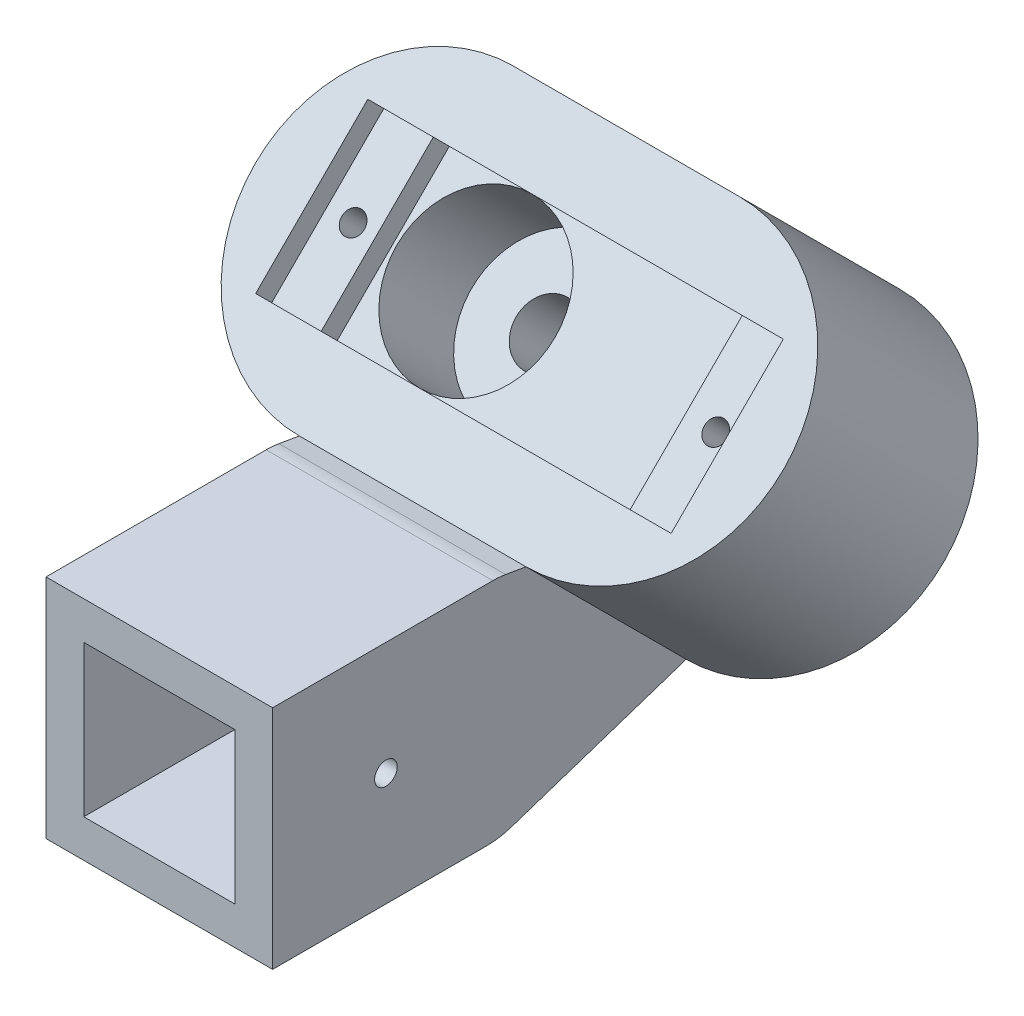
ISO-10303-21;
HEADER;
FILE_DESCRIPTION(('STEP AP214'),'2;1');
FILE_NAME('part.step','',(''),(''),'','','');
FILE_SCHEMA(('AUTOMOTIVE_DESIGN { 1 0 10303 214 1 1 1 1 }'));
ENDSEC;
DATA;
#1=APPLICATION_CONTEXT('core data for automotive mechanical design processes');
#2=APPLICATION_PROTOCOL_DEFINITION('international standard','automotive_design',2000,#1);
#3=PRODUCT_CONTEXT('',#1,'mechanical');
#4=PRODUCT('Part','Part','',(#3));
#5=PRODUCT_RELATED_PRODUCT_CATEGORY('part','',(#4));
#6=PRODUCT_DEFINITION_FORMATION('','',#4);
#7=PRODUCT_DEFINITION_CONTEXT('part definition',#1,'design');
#8=PRODUCT_DEFINITION('design','',#6,#7);
#9=PRODUCT_DEFINITION_SHAPE('','',#8);
#10=(LENGTH_UNIT() NAMED_UNIT(*) SI_UNIT(.MILLI.,.METRE.));
#11=(NAMED_UNIT(*) PLANE_ANGLE_UNIT() SI_UNIT($,.RADIAN.));
#12=(NAMED_UNIT(*) SI_UNIT($,.STERADIAN.) SOLID_ANGLE_UNIT());
#13=UNCERTAINTY_MEASURE_WITH_UNIT(LENGTH_MEASURE(1.E-05),#10,'distance_accuracy_value','');
#14=(GEOMETRIC_REPRESENTATION_CONTEXT(3) GLOBAL_UNCERTAINTY_ASSIGNED_CONTEXT((#13)) GLOBAL_UNIT_ASSIGNED_CONTEXT((#10,
#11,#12)) REPRESENTATION_CONTEXT('',''));
#15=CARTESIAN_POINT('',(0.,0.,0.));
#16=DIRECTION('',(0.,0.,1.));
#17=DIRECTION('',(1.,0.,0.));
#18=AXIS2_PLACEMENT_3D('',#15,#16,#17);
#19=CARTESIAN_POINT('',(-10.,5.20101012677687,-41.0121933088198));
#20=DIRECTION('',(0.,0.707106781186544,0.707106781186551));
#21=DIRECTION('',(0.,-0.707106781186551,0.707106781186544));
#22=AXIS2_PLACEMENT_3D('',#19,#20,#21);
#23=CYLINDRICAL_SURFACE('',#22,10.5);
#24=CARTESIAN_POINT('',(-10.,24.2928932188136,-21.920310216783));
#25=DIRECTION('',(0.,0.707106781186544,0.707106781186551));
#26=DIRECTION('',(0.,-0.707106781186551,0.707106781186544));
#27=AXIS2_PLACEMENT_3D('',#24,#25,#26);
#28=CIRCLE('',#27,10.5);
#29=CARTESIAN_POINT('',(-10.,16.8682720163548,-14.4956890143242));
#30=VERTEX_POINT('',#29);
#31=CARTESIAN_POINT('',(-10.,31.7175144212723,-29.3449314192417));
#32=VERTEX_POINT('',#31);
#33=EDGE_CURVE('E516',#30,#32,#28,.F.);
#34=ORIENTED_EDGE('',*,*,#33,.F.);
#35=EDGE_CURVE('E514',#32,#30,#28,.F.);
#36=ORIENTED_EDGE('',*,*,#35,.F.);
#37=EDGE_LOOP('',(#34,#36));
#38=FACE_BOUND('',#37,.T.);
#39=CARTESIAN_POINT('',(-10.,14.3933982822019,-31.8198051533947));
#40=DIRECTION('',(0.,-0.707106781186544,-0.707106781186551));
#41=DIRECTION('',(0.,0.707106781186551,-0.707106781186544));
#42=AXIS2_PLACEMENT_3D('',#39,#40,#41);
#43=CIRCLE('',#42,10.5);
#44=CARTESIAN_POINT('',(-10.,21.8180194846607,-39.2444263558534));
#45=VERTEX_POINT('',#44);
#46=EDGE_CURVE('E12',#45,#45,#43,.F.);
#47=ORIENTED_EDGE('',*,*,#46,.F.);
#48=EDGE_LOOP('',(#47));
#49=FACE_BOUND('',#48,.T.);
#50=ADVANCED_FACE('F190',(#38,#49),#23,.F.);
#51=CARTESIAN_POINT('',(0.,3.3076118445748,3.30761184457483));
#52=DIRECTION('',(0.,0.707106781186544,0.707106781186551));
#53=DIRECTION('',(0.,-0.707106781186551,0.707106781186544));
#54=AXIS2_PLACEMENT_3D('',#51,#52,#53);
#55=PLANE('',#54);
#56=DIRECTION('',(0.,0.707106781186551,-0.707106781186544));
#57=VECTOR('',#56,1.);
#58=CARTESIAN_POINT('',(19.95,18.9895923599144,-12.3743686707646));
#59=LINE('',#58,#57);
#60=CARTESIAN_POINT('',(19.95,18.9895923599144,-12.3743686707646));
#61=VERTEX_POINT('',#60);
#62=CARTESIAN_POINT('',(19.95,33.838834764832,-27.223611075682));
#63=VERTEX_POINT('',#62);
#64=EDGE_CURVE('E355',#61,#63,#59,.T.);
#65=ORIENTED_EDGE('',*,*,#64,.F.);
#66=DIRECTION('',(1.,0.,0.));
#67=VECTOR('',#66,1.);
#68=CARTESIAN_POINT('',(27.5,18.9895923599144,-12.3743686707646));
#69=LINE('',#68,#67);
#70=CARTESIAN_POINT('',(27.5,18.9895923599144,-12.3743686707646));
#71=VERTEX_POINT('',#70);
#72=EDGE_CURVE('E411',#61,#71,#69,.T.);
#73=ORIENTED_EDGE('',*,*,#72,.T.);
#74=DIRECTION('',(0.,0.707106781186551,-0.707106781186544));
#75=VECTOR('',#74,1.);
#76=CARTESIAN_POINT('',(27.5,18.9895923599144,-12.3743686707646));
#77=LINE('',#76,#75);
#78=CARTESIAN_POINT('',(27.5,33.838834764832,-27.223611075682));
#79=VERTEX_POINT('',#78);
#80=EDGE_CURVE('E416',#71,#79,#77,.T.);
#81=ORIENTED_EDGE('',*,*,#80,.T.);
#82=DIRECTION('',(-1.,0.,0.));
#83=VECTOR('',#82,1.);
#84=CARTESIAN_POINT('',(27.5,33.838834764832,-27.223611075682));
#85=LINE('',#84,#83);
#86=EDGE_CURVE('E420',#79,#63,#85,.T.);
#87=ORIENTED_EDGE('',*,*,#86,.T.);
#88=EDGE_LOOP('',(#65,#73,#81,#87));
#89=FACE_BOUND('',#88,.T.);
#90=CARTESIAN_POINT('',(24.,26.2696153655759,-19.654391676426));
#91=DIRECTION('',(0.,0.707106781186544,0.707106781186551));
#92=DIRECTION('',(0.,-0.707106781186551,0.707106781186544));
#93=AXIS2_PLACEMENT_3D('',#90,#91,#92);
#94=CIRCLE('',#93,1.5);
#95=CARTESIAN_POINT('',(24.,25.2089551937961,-18.5937315046462));
#96=VERTEX_POINT('',#95);
#97=EDGE_CURVE('E400',#96,#96,#94,.T.);
#98=ORIENTED_EDGE('',*,*,#97,.F.);
#99=EDGE_LOOP('',(#98));
#100=FACE_BOUND('',#99,.T.);
#101=ADVANCED_FACE('F707',(#89,#100),#55,.T.);
#102=CARTESIAN_POINT('',(0.,0.,30.));
#103=DIRECTION('',(0.,0.,-1.));
#104=DIRECTION('',(-1.,0.,0.));
#105=AXIS2_PLACEMENT_3D('',#102,#103,#104);
#106=PLANE('',#105);
#107=DIRECTION('',(0.,-1.,0.));
#108=VECTOR('',#107,1.);
#109=CARTESIAN_POINT('',(10.,0.,30.));
#110=LINE('',#109,#108);
#111=CARTESIAN_POINT('',(10.,10.,30.));
#112=VERTEX_POINT('',#111);
#113=CARTESIAN_POINT('',(9.99999999999997,-10.,30.));
#114=VERTEX_POINT('',#113);
#115=EDGE_CURVE('E688',#112,#114,#110,.T.);
#116=ORIENTED_EDGE('',*,*,#115,.T.);
#117=DIRECTION('',(-1.,0.,0.));
#118=VECTOR('',#117,1.);
#119=CARTESIAN_POINT('',(0.,-10.,30.));
#120=LINE('',#119,#118);
#121=CARTESIAN_POINT('',(-10.0000000000001,-9.99999999999993,30.));
#122=VERTEX_POINT('',#121);
#123=EDGE_CURVE('E689',#114,#122,#120,.T.);
#124=ORIENTED_EDGE('',*,*,#123,.T.);
#125=DIRECTION('',(0.,1.,0.));
#126=VECTOR('',#125,1.);
#127=CARTESIAN_POINT('',(-10.,0.,30.));
#128=LINE('',#127,#126);
#129=CARTESIAN_POINT('',(-9.9999999999999,10.0000000000001,30.));
#130=VERTEX_POINT('',#129);
#131=EDGE_CURVE('E576',#122,#130,#128,.T.);
#132=ORIENTED_EDGE('',*,*,#131,.T.);
#133=DIRECTION('',(1.,0.,0.));
#134=VECTOR('',#133,1.);
#135=CARTESIAN_POINT('',(0.,10.,30.));
#136=LINE('',#135,#134);
#137=EDGE_CURVE('E499',#130,#112,#136,.T.);
#138=ORIENTED_EDGE('',*,*,#137,.T.);
#139=EDGE_LOOP('',(#116,#124,#132,#138));
#140=FACE_BOUND('',#139,.T.);
#141=DIRECTION('',(1.,0.,0.));
#142=VECTOR('',#141,1.);
#143=CARTESIAN_POINT('',(-15.,15.,30.));
#144=LINE('',#143,#142);
#145=CARTESIAN_POINT('',(-15.,15.,30.));
#146=VERTEX_POINT('',#145);
#147=CARTESIAN_POINT('',(15.,15.,30.));
#148=VERTEX_POINT('',#147);
#149=EDGE_CURVE('E582',#146,#148,#144,.T.);
#150=ORIENTED_EDGE('',*,*,#149,.F.);
#151=DIRECTION('',(0.,-1.,0.));
#152=VECTOR('',#151,1.);
#153=CARTESIAN_POINT('',(-15.,15.,30.));
#154=LINE('',#153,#152);
#155=CARTESIAN_POINT('',(-15.,-15.,30.));
#156=VERTEX_POINT('',#155);
#157=EDGE_CURVE('E664',#146,#156,#154,.T.);
#158=ORIENTED_EDGE('',*,*,#157,.T.);
#159=DIRECTION('',(1.,0.,0.));
#160=VECTOR('',#159,1.);
#161=CARTESIAN_POINT('',(-15.,-15.,30.));
#162=LINE('',#161,#160);
#163=CARTESIAN_POINT('',(15.,-15.,30.));
#164=VERTEX_POINT('',#163);
#165=EDGE_CURVE('E662',#156,#164,#162,.T.);
#166=ORIENTED_EDGE('',*,*,#165,.T.);
#167=DIRECTION('',(0.,-1.,0.));
#168=VECTOR('',#167,1.);
#169=CARTESIAN_POINT('',(15.,15.,30.));
#170=LINE('',#169,#168);
#171=EDGE_CURVE('E564',#148,#164,#170,.T.);
#172=ORIENTED_EDGE('',*,*,#171,.F.);
#173=EDGE_LOOP('',(#150,#158,#166,#172));
#174=FACE_BOUND('',#173,.T.);
#175=ADVANCED_FACE('F697',(#140,#174),#106,.F.);
#176=CARTESIAN_POINT('',(-15.,15.,30.));
#177=DIRECTION('',(0.,1.,0.));
#178=DIRECTION('',(0.,0.,1.));
#179=AXIS2_PLACEMENT_3D('',#176,#177,#178);
#180=PLANE('',#179);
#181=DIRECTION('',(0.,0.,-1.));
#182=VECTOR('',#181,1.);
#183=CARTESIAN_POINT('',(15.,15.,30.));
#184=LINE('',#183,#182);
#185=CARTESIAN_POINT('',(15.,15.,0.851642331747414));
#186=VERTEX_POINT('',#185);
#187=EDGE_CURVE('E578',#148,#186,#184,.T.);
#188=ORIENTED_EDGE('',*,*,#187,.T.);
#189=DIRECTION('',(1.,0.,0.));
#190=VECTOR('',#189,1.);
#191=CARTESIAN_POINT('',(-15.,15.,0.851642331747414));
#192=LINE('',#191,#190);
#193=CARTESIAN_POINT('',(-15.,15.,0.851642331747414));
#194=VERTEX_POINT('',#193);
#195=EDGE_CURVE('E523',#186,#194,#192,.F.);
#196=ORIENTED_EDGE('',*,*,#195,.T.);
#197=DIRECTION('',(0.,0.,-1.));
#198=VECTOR('',#197,1.);
#199=CARTESIAN_POINT('',(-15.,15.,30.));
#200=LINE('',#199,#198);
#201=EDGE_CURVE('E581',#146,#194,#200,.T.);
#202=ORIENTED_EDGE('',*,*,#201,.F.);
#203=ORIENTED_EDGE('',*,*,#149,.T.);
#204=EDGE_LOOP('',(#188,#196,#202,#203));
#205=FACE_BOUND('',#204,.T.);
#206=ADVANCED_FACE('F658',(#205),#180,.T.);
#207=CARTESIAN_POINT('',(-15.,15.,30.));
#208=DIRECTION('',(1.,0.,0.));
#209=DIRECTION('',(0.,1.,0.));
#210=AXIS2_PLACEMENT_3D('',#207,#208,#209);
#211=PLANE('',#210);
#212=CARTESIAN_POINT('',(-15.,0.,15.));
#213=DIRECTION('',(1.,0.,0.));
#214=DIRECTION('',(0.,1.,0.));
#215=AXIS2_PLACEMENT_3D('',#212,#213,#214);
#216=CIRCLE('',#215,1.5);
#217=CARTESIAN_POINT('',(-15.,1.5,15.));
#218=VERTEX_POINT('',#217);
#219=EDGE_CURVE('E388',#218,#218,#216,.T.);
#220=ORIENTED_EDGE('',*,*,#219,.T.);
#221=EDGE_LOOP('',(#220));
#222=FACE_BOUND('',#221,.T.);
#223=DIRECTION('',(0.,-0.313831039327908,0.949478845869862));
#224=VECTOR('',#223,1.);
#225=CARTESIAN_POINT('',(-15.,-6.81980515339453,-24.7487373415293));
#226=LINE('',#225,#224);
#227=CARTESIAN_POINT('',(-15.,-6.81980515339453,-24.7487373415293));
#228=VERTEX_POINT('',#227);
#229=CARTESIAN_POINT('',(-15.,-14.4947884586986,-1.52849020983474));
#230=VERTEX_POINT('',#229);
#231=EDGE_CURVE('E500',#228,#230,#226,.T.);
#232=ORIENTED_EDGE('',*,*,#231,.T.);
#233=CARTESIAN_POINT('',(-15.,-5.,1.60982018344434));
#234=DIRECTION('',(1.,0.,0.));
#235=DIRECTION('',(0.,1.,0.));
#236=AXIS2_PLACEMENT_3D('',#233,#234,#235);
#237=CIRCLE('',#236,10.);
#238=CARTESIAN_POINT('',(-15.,-15.,1.60982018344434));
#239=VERTEX_POINT('',#238);
#240=EDGE_CURVE('E199',#230,#239,#237,.F.);
#241=ORIENTED_EDGE('',*,*,#240,.T.);
#242=DIRECTION('',(0.,0.,-1.));
#243=VECTOR('',#242,1.);
#244=CARTESIAN_POINT('',(-15.,-15.,30.));
#245=LINE('',#244,#243);
#246=EDGE_CURVE('E572',#156,#239,#245,.T.);
#247=ORIENTED_EDGE('',*,*,#246,.F.);
#248=ORIENTED_EDGE('',*,*,#157,.F.);
#249=ORIENTED_EDGE('',*,*,#201,.T.);
#250=CARTESIAN_POINT('',(-15.,5.,0.851642331747414));
#251=DIRECTION('',(1.,0.,0.));
#252=DIRECTION('',(0.,1.,0.));
#253=AXIS2_PLACEMENT_3D('',#250,#251,#252);
#254=CIRCLE('',#253,10.);
#255=CARTESIAN_POINT('',(-15.,14.8559855965349,-0.839377455510205));
#256=VERTEX_POINT('',#255);
#257=EDGE_CURVE('E525',#194,#256,#254,.F.);
#258=ORIENTED_EDGE('',*,*,#257,.T.);
#259=DIRECTION('',(0.,0.169101978725762,0.985598559653489));
#260=VECTOR('',#259,1.);
#261=CARTESIAN_POINT('',(-15.,14.3933982822018,-3.53553390593277));
#262=LINE('',#261,#260);
#263=CARTESIAN_POINT('',(-15.,14.3933982822018,-3.53553390593277));
#264=VERTEX_POINT('',#263);
#265=EDGE_CURVE('E510',#264,#256,#262,.T.);
#266=ORIENTED_EDGE('',*,*,#265,.F.);
#267=DIRECTION('',(0.,-0.707106781186544,-0.707106781186551));
#268=VECTOR('',#267,1.);
#269=CARTESIAN_POINT('',(-15.,14.3933982822018,-3.53553390593277));
#270=LINE('',#269,#268);
#271=EDGE_CURVE('E451',#264,#228,#270,.T.);
#272=ORIENTED_EDGE('',*,*,#271,.T.);
#273=EDGE_LOOP('',(#232,#241,#247,#248,#249,#258,#266,#272));
#274=FACE_BOUND('',#273,.T.);
#275=ADVANCED_FACE('F698',(#222,#274),#211,.F.);
#276=CARTESIAN_POINT('',(-15.,-15.,30.));
#277=DIRECTION('',(0.,1.,0.));
#278=DIRECTION('',(0.,0.,1.));
#279=AXIS2_PLACEMENT_3D('',#276,#277,#278);
#280=PLANE('',#279);
#281=ORIENTED_EDGE('',*,*,#246,.T.);
#282=DIRECTION('',(1.,0.,0.));
#283=VECTOR('',#282,1.);
#284=CARTESIAN_POINT('',(15.,-15.,1.60982018344434));
#285=LINE('',#284,#283);
#286=CARTESIAN_POINT('',(15.,-15.,1.60982018344434));
#287=VERTEX_POINT('',#286);
#288=EDGE_CURVE('E527',#239,#287,#285,.T.);
#289=ORIENTED_EDGE('',*,*,#288,.T.);
#290=DIRECTION('',(0.,0.,-1.));
#291=VECTOR('',#290,1.);
#292=CARTESIAN_POINT('',(15.,-15.,30.));
#293=LINE('',#292,#291);
#294=EDGE_CURVE('E562',#164,#287,#293,.T.);
#295=ORIENTED_EDGE('',*,*,#294,.F.);
#296=ORIENTED_EDGE('',*,*,#165,.F.);
#297=EDGE_LOOP('',(#281,#289,#295,#296));
#298=FACE_BOUND('',#297,.T.);
#299=ADVANCED_FACE('F558',(#298),#280,.F.);
#300=CARTESIAN_POINT('',(15.,15.,30.));
#301=DIRECTION('',(1.,0.,0.));
#302=DIRECTION('',(0.,1.,0.));
#303=AXIS2_PLACEMENT_3D('',#300,#301,#302);
#304=PLANE('',#303);
#305=CARTESIAN_POINT('',(15.,0.,15.));
#306=DIRECTION('',(1.,0.,0.));
#307=DIRECTION('',(0.,1.,0.));
#308=AXIS2_PLACEMENT_3D('',#305,#306,#307);
#309=CIRCLE('',#308,1.5);
#310=CARTESIAN_POINT('',(15.,1.5,15.));
#311=VERTEX_POINT('',#310);
#312=EDGE_CURVE('E381',#311,#311,#309,.T.);
#313=ORIENTED_EDGE('',*,*,#312,.F.);
#314=EDGE_LOOP('',(#313));
#315=FACE_BOUND('',#314,.T.);
#316=ORIENTED_EDGE('',*,*,#294,.T.);
#317=CARTESIAN_POINT('',(15.,-5.,1.60982018344434));
#318=DIRECTION('',(1.,0.,0.));
#319=DIRECTION('',(0.,1.,0.));
#320=AXIS2_PLACEMENT_3D('',#317,#318,#319);
#321=CIRCLE('',#320,10.);
#322=CARTESIAN_POINT('',(15.,-14.4947884586986,-1.52849020983474));
#323=VERTEX_POINT('',#322);
#324=EDGE_CURVE('E215',#287,#323,#321,.T.);
#325=ORIENTED_EDGE('',*,*,#324,.T.);
#326=DIRECTION('',(0.,-0.313831039327908,0.949478845869862));
#327=VECTOR('',#326,1.);
#328=CARTESIAN_POINT('',(15.,-6.81980515339453,-24.7487373415293));
#329=LINE('',#328,#327);
#330=CARTESIAN_POINT('',(15.,-6.81980515339453,-24.7487373415293));
#331=VERTEX_POINT('',#330);
#332=EDGE_CURVE('E492',#331,#323,#329,.T.);
#333=ORIENTED_EDGE('',*,*,#332,.F.);
#334=DIRECTION('',(0.,0.707106781186544,0.707106781186551));
#335=VECTOR('',#334,1.);
#336=CARTESIAN_POINT('',(15.,14.3933982822018,-3.53553390593277));
#337=LINE('',#336,#335);
#338=CARTESIAN_POINT('',(15.,14.3933982822018,-3.53553390593277));
#339=VERTEX_POINT('',#338);
#340=EDGE_CURVE('E511',#331,#339,#337,.T.);
#341=ORIENTED_EDGE('',*,*,#340,.T.);
#342=DIRECTION('',(0.,0.169101978725761,0.985598559653489));
#343=VECTOR('',#342,1.);
#344=CARTESIAN_POINT('',(15.,14.3933982822018,-3.53553390593277));
#345=LINE('',#344,#343);
#346=CARTESIAN_POINT('',(15.,14.8559855965349,-0.839377455510204));
#347=VERTEX_POINT('',#346);
#348=EDGE_CURVE('E465',#339,#347,#345,.T.);
#349=ORIENTED_EDGE('',*,*,#348,.T.);
#350=CARTESIAN_POINT('',(15.,5.,0.851642331747414));
#351=DIRECTION('',(1.,0.,0.));
#352=DIRECTION('',(0.,1.,0.));
#353=AXIS2_PLACEMENT_3D('',#350,#351,#352);
#354=CIRCLE('',#353,10.);
#355=EDGE_CURVE('E521',#347,#186,#354,.T.);
#356=ORIENTED_EDGE('',*,*,#355,.T.);
#357=ORIENTED_EDGE('',*,*,#187,.F.);
#358=ORIENTED_EDGE('',*,*,#171,.T.);
#359=EDGE_LOOP('',(#316,#325,#333,#341,#349,#356,#357,#358));
#360=FACE_BOUND('',#359,.T.);
#361=ADVANCED_FACE('F555',(#315,#360),#304,.T.);
#362=CARTESIAN_POINT('',(1.02651068073857E-13,10.,30.));
#363=DIRECTION('',(0.,1.,0.));
#364=DIRECTION('',(-1.,0.,0.));
#365=AXIS2_PLACEMENT_3D('',#362,#363,#364);
#366=PLANE('',#365);
#367=DIRECTION('',(1.,0.,0.));
#368=VECTOR('',#367,1.);
#369=CARTESIAN_POINT('',(1.02651068073857E-13,10.,0.));
#370=LINE('',#369,#368);
#371=CARTESIAN_POINT('',(-9.9999999999999,10.0000000000001,0.));
#372=VERTEX_POINT('',#371);
#373=CARTESIAN_POINT('',(10.,10.,0.));
#374=VERTEX_POINT('',#373);
#375=EDGE_CURVE('E567',#372,#374,#370,.T.);
#376=ORIENTED_EDGE('',*,*,#375,.T.);
#377=DIRECTION('',(0.,0.,-1.));
#378=VECTOR('',#377,1.);
#379=CARTESIAN_POINT('',(10.,10.,30.));
#380=LINE('',#379,#378);
#381=EDGE_CURVE('E517',#112,#374,#380,.T.);
#382=ORIENTED_EDGE('',*,*,#381,.F.);
#383=ORIENTED_EDGE('',*,*,#137,.F.);
#384=DIRECTION('',(0.,0.,-1.));
#385=VECTOR('',#384,1.);
#386=CARTESIAN_POINT('',(-9.9999999999999,10.0000000000001,30.));
#387=LINE('',#386,#385);
#388=EDGE_CURVE('E570',#130,#372,#387,.T.);
#389=ORIENTED_EDGE('',*,*,#388,.T.);
#390=EDGE_LOOP('',(#376,#382,#383,#389));
#391=FACE_BOUND('',#390,.T.);
#392=ADVANCED_FACE('F557',(#391),#366,.F.);
#393=CARTESIAN_POINT('',(-10.,1.02651068073857E-13,30.));
#394=DIRECTION('',(-1.,0.,0.));
#395=DIRECTION('',(0.,-1.,0.));
#396=AXIS2_PLACEMENT_3D('',#393,#394,#395);
#397=PLANE('',#396);
#398=DIRECTION('',(0.,1.,0.));
#399=VECTOR('',#398,1.);
#400=CARTESIAN_POINT('',(-10.,1.02651068073857E-13,0.));
#401=LINE('',#400,#399);
#402=CARTESIAN_POINT('',(-10.0000000000001,-9.99999999999993,0.));
#403=VERTEX_POINT('',#402);
#404=EDGE_CURVE('E669',#403,#372,#401,.T.);
#405=ORIENTED_EDGE('',*,*,#404,.T.);
#406=ORIENTED_EDGE('',*,*,#388,.F.);
#407=ORIENTED_EDGE('',*,*,#131,.F.);
#408=DIRECTION('',(0.,0.,-1.));
#409=VECTOR('',#408,1.);
#410=CARTESIAN_POINT('',(-10.0000000000001,-9.99999999999993,30.));
#411=LINE('',#410,#409);
#412=EDGE_CURVE('E670',#122,#403,#411,.T.);
#413=ORIENTED_EDGE('',*,*,#412,.T.);
#414=EDGE_LOOP('',(#405,#406,#407,#413));
#415=FACE_BOUND('',#414,.T.);
#416=CARTESIAN_POINT('',(-9.99999999999997,0.,15.));
#417=DIRECTION('',(-1.,0.,0.));
#418=DIRECTION('',(0.,0.,1.));
#419=AXIS2_PLACEMENT_3D('',#416,#417,#418);
#420=CIRCLE('',#419,1.5);
#421=CARTESIAN_POINT('',(-9.99999999999997,0.,16.5));
#422=VERTEX_POINT('',#421);
#423=EDGE_CURVE('E532',#422,#422,#420,.F.);
#424=ORIENTED_EDGE('',*,*,#423,.F.);
#425=EDGE_LOOP('',(#424));
#426=FACE_BOUND('',#425,.T.);
#427=ADVANCED_FACE('F925',(#415,#426),#397,.F.);
#428=CARTESIAN_POINT('',(0.,-10.,30.));
#429=DIRECTION('',(0.,-1.,0.));
#430=DIRECTION('',(1.,0.,0.));
#431=AXIS2_PLACEMENT_3D('',#428,#429,#430);
#432=PLANE('',#431);
#433=DIRECTION('',(-1.,0.,0.));
#434=VECTOR('',#433,1.);
#435=CARTESIAN_POINT('',(0.,-10.,0.));
#436=LINE('',#435,#434);
#437=CARTESIAN_POINT('',(9.99999999999997,-10.,0.));
#438=VERTEX_POINT('',#437);
#439=EDGE_CURVE('E673',#438,#403,#436,.T.);
#440=ORIENTED_EDGE('',*,*,#439,.T.);
#441=ORIENTED_EDGE('',*,*,#412,.F.);
#442=ORIENTED_EDGE('',*,*,#123,.F.);
#443=DIRECTION('',(0.,0.,-1.));
#444=VECTOR('',#443,1.);
#445=CARTESIAN_POINT('',(9.99999999999997,-10.,30.));
#446=LINE('',#445,#444);
#447=EDGE_CURVE('E674',#114,#438,#446,.T.);
#448=ORIENTED_EDGE('',*,*,#447,.T.);
#449=EDGE_LOOP('',(#440,#441,#442,#448));
#450=FACE_BOUND('',#449,.T.);
#451=ADVANCED_FACE('F917',(#450),#432,.F.);
#452=CARTESIAN_POINT('',(10.,0.,30.));
#453=DIRECTION('',(1.,0.,0.));
#454=DIRECTION('',(0.,1.,0.));
#455=AXIS2_PLACEMENT_3D('',#452,#453,#454);
#456=PLANE('',#455);
#457=DIRECTION('',(0.,-1.,0.));
#458=VECTOR('',#457,1.);
#459=CARTESIAN_POINT('',(10.,0.,0.));
#460=LINE('',#459,#458);
#461=EDGE_CURVE('E677',#374,#438,#460,.T.);
#462=ORIENTED_EDGE('',*,*,#461,.T.);
#463=ORIENTED_EDGE('',*,*,#447,.F.);
#464=ORIENTED_EDGE('',*,*,#115,.F.);
#465=ORIENTED_EDGE('',*,*,#381,.T.);
#466=EDGE_LOOP('',(#462,#463,#464,#465));
#467=FACE_BOUND('',#466,.T.);
#468=CARTESIAN_POINT('',(9.99999999999996,0.,15.));
#469=DIRECTION('',(1.,0.,0.));
#470=DIRECTION('',(0.,0.,-1.));
#471=AXIS2_PLACEMENT_3D('',#468,#469,#470);
#472=CIRCLE('',#471,1.5);
#473=CARTESIAN_POINT('',(9.99999999999996,0.,13.5));
#474=VERTEX_POINT('',#473);
#475=EDGE_CURVE('E194',#474,#474,#472,.F.);
#476=ORIENTED_EDGE('',*,*,#475,.F.);
#477=EDGE_LOOP('',(#476));
#478=FACE_BOUND('',#477,.T.);
#479=ADVANCED_FACE('F909',(#467,#478),#456,.F.);
#480=CARTESIAN_POINT('',(0.,0.,0.));
#481=DIRECTION('',(0.,0.,1.));
#482=DIRECTION('',(1.,0.,0.));
#483=AXIS2_PLACEMENT_3D('',#480,#481,#482);
#484=PLANE('',#483);
#485=ORIENTED_EDGE('',*,*,#404,.F.);
#486=ORIENTED_EDGE('',*,*,#439,.F.);
#487=ORIENTED_EDGE('',*,*,#461,.F.);
#488=ORIENTED_EDGE('',*,*,#375,.F.);
#489=EDGE_LOOP('',(#485,#486,#487,#488));
#490=FACE_BOUND('',#489,.T.);
#491=ADVANCED_FACE('F478',(#490),#484,.T.);
#492=CARTESIAN_POINT('',(0.,14.5710678118655,-2.49999999999999));
#493=DIRECTION('',(0.,0.985598559653489,-0.169101978725762));
#494=DIRECTION('',(0.,0.169101978725762,0.985598559653489));
#495=AXIS2_PLACEMENT_3D('',#492,#493,#494);
#496=PLANE('',#495);
#497=ORIENTED_EDGE('',*,*,#265,.T.);
#498=DIRECTION('',(1.,0.,0.));
#499=VECTOR('',#498,1.);
#500=CARTESIAN_POINT('',(0.,14.8559855965349,-0.839377455510205));
#501=LINE('',#500,#499);
#502=EDGE_CURVE('E518',#256,#347,#501,.T.);
#503=ORIENTED_EDGE('',*,*,#502,.T.);
#504=ORIENTED_EDGE('',*,*,#348,.F.);
#505=DIRECTION('',(-1.,0.,0.));
#506=VECTOR('',#505,1.);
#507=CARTESIAN_POINT('',(-15.,14.3933982822018,-3.53553390593277));
#508=LINE('',#507,#506);
#509=EDGE_CURVE('E460',#339,#264,#508,.T.);
#510=ORIENTED_EDGE('',*,*,#509,.T.);
#511=EDGE_LOOP('',(#497,#503,#504,#510));
#512=FACE_BOUND('',#511,.T.);
#513=ADVANCED_FACE('F467',(#512),#496,.T.);
#514=CARTESIAN_POINT('',(0.,-13.5226511813155,-4.46963899528802));
#515=DIRECTION('',(0.,-0.949478845869862,-0.313831039327908));
#516=DIRECTION('',(0.,0.313831039327908,-0.949478845869862));
#517=AXIS2_PLACEMENT_3D('',#514,#515,#516);
#518=PLANE('',#517);
#519=ORIENTED_EDGE('',*,*,#332,.T.);
#520=DIRECTION('',(1.,0.,0.));
#521=VECTOR('',#520,1.);
#522=CARTESIAN_POINT('',(-15.,-14.4947884586986,-1.52849020983474));
#523=LINE('',#522,#521);
#524=EDGE_CURVE('E207',#323,#230,#523,.F.);
#525=ORIENTED_EDGE('',*,*,#524,.T.);
#526=ORIENTED_EDGE('',*,*,#231,.F.);
#527=DIRECTION('',(1.,0.,0.));
#528=VECTOR('',#527,1.);
#529=CARTESIAN_POINT('',(-15.,-6.81980515339453,-24.7487373415293));
#530=LINE('',#529,#528);
#531=EDGE_CURVE('E512',#228,#331,#530,.T.);
#532=ORIENTED_EDGE('',*,*,#531,.T.);
#533=EDGE_LOOP('',(#519,#525,#526,#532));
#534=FACE_BOUND('',#533,.T.);
#535=ADVANCED_FACE('F477',(#534),#518,.T.);
#536=CARTESIAN_POINT('',(15.,7.32233047033651,-38.8908729652602));
#537=DIRECTION('',(0.,0.707106781186544,0.707106781186551));
#538=DIRECTION('',(0.,-0.707106781186551,0.707106781186544));
#539=AXIS2_PLACEMENT_3D('',#536,#537,#538);
#540=CYLINDRICAL_SURFACE('',#539,20.);
#541=CARTESIAN_POINT('',(15.,28.5355339059328,-17.6776695296636));
#542=DIRECTION('',(0.,0.707106781186544,0.707106781186551));
#543=DIRECTION('',(0.,-0.707106781186551,0.707106781186544));
#544=AXIS2_PLACEMENT_3D('',#541,#542,#543);
#545=CIRCLE('',#544,20.);
#546=CARTESIAN_POINT('',(15.,42.6776695296639,-31.8198051533945));
#547=VERTEX_POINT('',#546);
#548=EDGE_CURVE('E433',#339,#547,#545,.T.);
#549=ORIENTED_EDGE('',*,*,#548,.F.);
#550=ORIENTED_EDGE('',*,*,#340,.F.);
#551=CARTESIAN_POINT('',(15.,7.32233047033651,-38.8908729652602));
#552=DIRECTION('',(0.,0.707106781186544,0.707106781186551));
#553=DIRECTION('',(0.,-0.707106781186551,0.707106781186544));
#554=AXIS2_PLACEMENT_3D('',#551,#552,#553);
#555=CIRCLE('',#554,20.);
#556=CARTESIAN_POINT('',(15.,21.4644660940675,-53.0330085889911));
#557=VERTEX_POINT('',#556);
#558=EDGE_CURVE('E444',#331,#557,#555,.T.);
#559=ORIENTED_EDGE('',*,*,#558,.T.);
#560=DIRECTION('',(0.,0.707106781186544,0.707106781186551));
#561=VECTOR('',#560,1.);
#562=CARTESIAN_POINT('',(15.,21.4644660940675,-53.0330085889911));
#563=LINE('',#562,#561);
#564=EDGE_CURVE('E452',#557,#547,#563,.T.);
#565=ORIENTED_EDGE('',*,*,#564,.T.);
#566=EDGE_LOOP('',(#549,#550,#559,#565));
#567=FACE_BOUND('',#566,.T.);
#568=ADVANCED_FACE('F479',(#567),#540,.T.);
#569=CARTESIAN_POINT('',(-15.,7.3223304703365,-38.8908729652602));
#570=DIRECTION('',(0.,0.707106781186544,0.707106781186551));
#571=DIRECTION('',(0.,-0.707106781186551,0.707106781186544));
#572=AXIS2_PLACEMENT_3D('',#569,#570,#571);
#573=CYLINDRICAL_SURFACE('',#572,20.);
#574=CARTESIAN_POINT('',(-15.,28.5355339059328,-17.6776695296636));
#575=DIRECTION('',(0.,0.707106781186544,0.707106781186551));
#576=DIRECTION('',(0.,-0.707106781186551,0.707106781186544));
#577=AXIS2_PLACEMENT_3D('',#574,#575,#576);
#578=CIRCLE('',#577,20.);
#579=CARTESIAN_POINT('',(-15.,42.6776695296638,-31.8198051533945));
#580=VERTEX_POINT('',#579);
#581=EDGE_CURVE('E448',#580,#264,#578,.T.);
#582=ORIENTED_EDGE('',*,*,#581,.F.);
#583=DIRECTION('',(0.,0.707106781186544,0.707106781186551));
#584=VECTOR('',#583,1.);
#585=CARTESIAN_POINT('',(-15.,21.4644660940675,-53.0330085889911));
#586=LINE('',#585,#584);
#587=CARTESIAN_POINT('',(-15.,21.4644660940675,-53.0330085889911));
#588=VERTEX_POINT('',#587);
#589=EDGE_CURVE('E449',#588,#580,#586,.T.);
#590=ORIENTED_EDGE('',*,*,#589,.F.);
#591=CARTESIAN_POINT('',(-15.,7.3223304703365,-38.8908729652602));
#592=DIRECTION('',(0.,0.707106781186544,0.707106781186551));
#593=DIRECTION('',(0.,-0.707106781186551,0.707106781186544));
#594=AXIS2_PLACEMENT_3D('',#591,#592,#593);
#595=CIRCLE('',#594,20.);
#596=EDGE_CURVE('E443',#588,#228,#595,.T.);
#597=ORIENTED_EDGE('',*,*,#596,.T.);
#598=ORIENTED_EDGE('',*,*,#271,.F.);
#599=EDGE_LOOP('',(#582,#590,#597,#598));
#600=FACE_BOUND('',#599,.T.);
#601=ADVANCED_FACE('F619',(#600),#573,.T.);
#602=CARTESIAN_POINT('',(15.,21.4644660940675,-53.0330085889911));
#603=DIRECTION('',(0.,0.707106781186551,-0.707106781186544));
#604=DIRECTION('',(0.,0.707106781186544,0.707106781186551));
#605=AXIS2_PLACEMENT_3D('',#602,#603,#604);
#606=PLANE('',#605);
#607=DIRECTION('',(-1.,0.,0.));
#608=VECTOR('',#607,1.);
#609=CARTESIAN_POINT('',(15.,42.6776695296639,-31.8198051533945));
#610=LINE('',#609,#608);
#611=EDGE_CURVE('E445',#547,#580,#610,.T.);
#612=ORIENTED_EDGE('',*,*,#611,.F.);
#613=ORIENTED_EDGE('',*,*,#564,.F.);
#614=DIRECTION('',(-1.,0.,0.));
#615=VECTOR('',#614,1.);
#616=CARTESIAN_POINT('',(15.,21.4644660940675,-53.0330085889911));
#617=LINE('',#616,#615);
#618=EDGE_CURVE('E440',#557,#588,#617,.T.);
#619=ORIENTED_EDGE('',*,*,#618,.T.);
#620=ORIENTED_EDGE('',*,*,#589,.T.);
#621=EDGE_LOOP('',(#612,#613,#619,#620));
#622=FACE_BOUND('',#621,.T.);
#623=ADVANCED_FACE('F612',(#622),#606,.T.);
#624=CARTESIAN_POINT('',(15.,7.32233047033651,-38.8908729652602));
#625=DIRECTION('',(0.,0.707106781186544,0.707106781186551));
#626=DIRECTION('',(0.,-0.707106781186551,0.707106781186544));
#627=AXIS2_PLACEMENT_3D('',#624,#625,#626);
#628=PLANE('',#627);
#629=ORIENTED_EDGE('',*,*,#558,.F.);
#630=ORIENTED_EDGE('',*,*,#531,.F.);
#631=ORIENTED_EDGE('',*,*,#596,.F.);
#632=ORIENTED_EDGE('',*,*,#618,.F.);
#633=EDGE_LOOP('',(#629,#630,#631,#632));
#634=FACE_BOUND('',#633,.T.);
#635=CARTESIAN_POINT('',(-10.4499999999999,7.17773227353905,-38.7462747684627));
#636=DIRECTION('',(0.,-0.707106781186544,-0.707106781186551));
#637=DIRECTION('',(0.,0.707106781186551,-0.707106781186544));
#638=AXIS2_PLACEMENT_3D('',#635,#636,#637);
#639=CIRCLE('',#638,4.);
#640=CARTESIAN_POINT('',(-10.4499999999999,10.0061593982853,-41.5747018932089));
#641=VERTEX_POINT('',#640);
#642=EDGE_CURVE('E537',#641,#641,#639,.T.);
#643=ORIENTED_EDGE('',*,*,#642,.F.);
#644=EDGE_LOOP('',(#643));
#645=FACE_BOUND('',#644,.T.);
#646=ADVANCED_FACE('F601',(#634,#645),#628,.F.);
#647=CARTESIAN_POINT('',(15.,28.5355339059328,-17.6776695296636));
#648=DIRECTION('',(0.,0.707106781186544,0.707106781186551));
#649=DIRECTION('',(0.,-0.707106781186551,0.707106781186544));
#650=AXIS2_PLACEMENT_3D('',#647,#648,#649);
#651=PLANE('',#650);
#652=DIRECTION('',(0.,-0.707106781186551,0.707106781186544));
#653=VECTOR('',#652,1.);
#654=CARTESIAN_POINT('',(-27.5,21.110912703474,-10.2530483272049));
#655=LINE('',#654,#653);
#656=CARTESIAN_POINT('',(-27.5,35.9601551083916,-25.1022907321224));
#657=VERTEX_POINT('',#656);
#658=CARTESIAN_POINT('',(-27.5,21.110912703474,-10.2530483272049));
#659=VERTEX_POINT('',#658);
#660=EDGE_CURVE('E399',#657,#659,#655,.T.);
#661=ORIENTED_EDGE('',*,*,#660,.F.);
#662=DIRECTION('',(-1.,0.,0.));
#663=VECTOR('',#662,1.);
#664=CARTESIAN_POINT('',(27.5,35.9601551083916,-25.1022907321224));
#665=LINE('',#664,#663);
#666=CARTESIAN_POINT('',(27.5,35.9601551083916,-25.1022907321224));
#667=VERTEX_POINT('',#666);
#668=EDGE_CURVE('E412',#667,#657,#665,.T.);
#669=ORIENTED_EDGE('',*,*,#668,.F.);
#670=DIRECTION('',(0.,0.707106781186551,-0.707106781186544));
#671=VECTOR('',#670,1.);
#672=CARTESIAN_POINT('',(27.5,21.110912703474,-10.2530483272049));
#673=LINE('',#672,#671);
#674=CARTESIAN_POINT('',(27.5,21.110912703474,-10.2530483272049));
#675=VERTEX_POINT('',#674);
#676=EDGE_CURVE('E427',#675,#667,#673,.T.);
#677=ORIENTED_EDGE('',*,*,#676,.F.);
#678=DIRECTION('',(1.,0.,0.));
#679=VECTOR('',#678,1.);
#680=CARTESIAN_POINT('',(27.5,21.110912703474,-10.2530483272049));
#681=LINE('',#680,#679);
#682=EDGE_CURVE('E424',#659,#675,#681,.T.);
#683=ORIENTED_EDGE('',*,*,#682,.F.);
#684=EDGE_LOOP('',(#661,#669,#677,#683));
#685=FACE_BOUND('',#684,.T.);
#686=ORIENTED_EDGE('',*,*,#548,.T.);
#687=ORIENTED_EDGE('',*,*,#611,.T.);
#688=ORIENTED_EDGE('',*,*,#581,.T.);
#689=ORIENTED_EDGE('',*,*,#509,.F.);
#690=EDGE_LOOP('',(#686,#687,#688,#689));
#691=FACE_BOUND('',#690,.T.);
#692=ADVANCED_FACE('F611',(#685,#691),#651,.T.);
#693=CARTESIAN_POINT('',(-27.5,18.9895923599144,-12.3743686707646));
#694=DIRECTION('',(-1.,0.,0.));
#695=DIRECTION('',(0.,0.,1.));
#696=AXIS2_PLACEMENT_3D('',#693,#694,#695);
#697=PLANE('',#696);
#698=ORIENTED_EDGE('',*,*,#660,.T.);
#699=DIRECTION('',(0.,0.707106781186544,0.707106781186551));
#700=VECTOR('',#699,1.);
#701=CARTESIAN_POINT('',(-27.5,18.9895923599144,-12.3743686707646));
#702=LINE('',#701,#700);
#703=CARTESIAN_POINT('',(-27.5,18.9895923599144,-12.3743686707646));
#704=VERTEX_POINT('',#703);
#705=EDGE_CURVE('E422',#704,#659,#702,.T.);
#706=ORIENTED_EDGE('',*,*,#705,.F.);
#707=DIRECTION('',(0.,-0.707106781186551,0.707106781186544));
#708=VECTOR('',#707,1.);
#709=CARTESIAN_POINT('',(-27.5,18.9895923599144,-12.3743686707646));
#710=LINE('',#709,#708);
#711=CARTESIAN_POINT('',(-27.5,33.838834764832,-27.223611075682));
#712=VERTEX_POINT('',#711);
#713=EDGE_CURVE('E408',#712,#704,#710,.T.);
#714=ORIENTED_EDGE('',*,*,#713,.F.);
#715=DIRECTION('',(0.,0.707106781186544,0.707106781186551));
#716=VECTOR('',#715,1.);
#717=CARTESIAN_POINT('',(-27.5,33.838834764832,-27.223611075682));
#718=LINE('',#717,#716);
#719=EDGE_CURVE('E431',#712,#657,#718,.T.);
#720=ORIENTED_EDGE('',*,*,#719,.T.);
#721=EDGE_LOOP('',(#698,#706,#714,#720));
#722=FACE_BOUND('',#721,.T.);
#723=ADVANCED_FACE('F613',(#722),#697,.F.);
#724=CARTESIAN_POINT('',(27.5,33.838834764832,-27.223611075682));
#725=DIRECTION('',(0.,0.707106781186551,-0.707106781186544));
#726=DIRECTION('',(0.,0.707106781186544,0.707106781186551));
#727=AXIS2_PLACEMENT_3D('',#724,#725,#726);
#728=PLANE('',#727);
#729=ORIENTED_EDGE('',*,*,#668,.T.);
#730=ORIENTED_EDGE('',*,*,#719,.F.);
#731=CARTESIAN_POINT('',(-20.95,33.838834764832,-27.223611075682));
#732=VERTEX_POINT('',#731);
#733=EDGE_CURVE('E419',#732,#712,#85,.T.);
#734=ORIENTED_EDGE('',*,*,#733,.F.);
#735=DIRECTION('',(0.,0.707106781186544,0.707106781186551));
#736=VECTOR('',#735,1.);
#737=CARTESIAN_POINT('',(-20.95,31.7175144212723,-29.3449314192417));
#738=LINE('',#737,#736);
#739=CARTESIAN_POINT('',(-20.95,31.7175144212723,-29.3449314192417));
#740=VERTEX_POINT('',#739);
#741=EDGE_CURVE('E359',#740,#732,#738,.T.);
#742=ORIENTED_EDGE('',*,*,#741,.F.);
#743=DIRECTION('',(-1.,0.,0.));
#744=VECTOR('',#743,1.);
#745=CARTESIAN_POINT('',(19.95,31.7175144212723,-29.3449314192417));
#746=LINE('',#745,#744);
#747=EDGE_CURVE('E367',#32,#740,#746,.T.);
#748=ORIENTED_EDGE('',*,*,#747,.F.);
#749=CARTESIAN_POINT('',(19.95,31.7175144212723,-29.3449314192417));
#750=VERTEX_POINT('',#749);
#751=EDGE_CURVE('E363',#750,#32,#746,.T.);
#752=ORIENTED_EDGE('',*,*,#751,.F.);
#753=DIRECTION('',(0.,0.707106781186544,0.707106781186551));
#754=VECTOR('',#753,1.);
#755=CARTESIAN_POINT('',(19.95,31.7175144212723,-29.3449314192417));
#756=LINE('',#755,#754);
#757=EDGE_CURVE('E349',#750,#63,#756,.T.);
#758=ORIENTED_EDGE('',*,*,#757,.T.);
#759=ORIENTED_EDGE('',*,*,#86,.F.);
#760=DIRECTION('',(0.,0.707106781186544,0.707106781186551));
#761=VECTOR('',#760,1.);
#762=CARTESIAN_POINT('',(27.5,33.838834764832,-27.223611075682));
#763=LINE('',#762,#761);
#764=EDGE_CURVE('E434',#79,#667,#763,.T.);
#765=ORIENTED_EDGE('',*,*,#764,.T.);
#766=EDGE_LOOP('',(#729,#730,#734,#742,#748,#752,#758,#759,#765));
#767=FACE_BOUND('',#766,.T.);
#768=ADVANCED_FACE('F365',(#767),#728,.F.);
#769=CARTESIAN_POINT('',(27.5,18.9895923599144,-12.3743686707646));
#770=DIRECTION('',(1.,0.,0.));
#771=DIRECTION('',(0.,0.,-1.));
#772=AXIS2_PLACEMENT_3D('',#769,#770,#771);
#773=PLANE('',#772);
#774=ORIENTED_EDGE('',*,*,#676,.T.);
#775=ORIENTED_EDGE('',*,*,#764,.F.);
#776=ORIENTED_EDGE('',*,*,#80,.F.);
#777=DIRECTION('',(0.,0.707106781186544,0.707106781186551));
#778=VECTOR('',#777,1.);
#779=CARTESIAN_POINT('',(27.5,18.9895923599144,-12.3743686707646));
#780=LINE('',#779,#778);
#781=EDGE_CURVE('E436',#71,#675,#780,.T.);
#782=ORIENTED_EDGE('',*,*,#781,.T.);
#783=EDGE_LOOP('',(#774,#775,#776,#782));
#784=FACE_BOUND('',#783,.T.);
#785=ADVANCED_FACE('F743',(#784),#773,.F.);
#786=CARTESIAN_POINT('',(27.5,18.9895923599144,-12.3743686707646));
#787=DIRECTION('',(0.,-0.707106781186551,0.707106781186544));
#788=DIRECTION('',(0.,-0.707106781186544,-0.707106781186551));
#789=AXIS2_PLACEMENT_3D('',#786,#787,#788);
#790=PLANE('',#789);
#791=ORIENTED_EDGE('',*,*,#72,.F.);
#792=DIRECTION('',(0.,0.707106781186544,0.707106781186551));
#793=VECTOR('',#792,1.);
#794=CARTESIAN_POINT('',(19.95,16.8682720163548,-14.4956890143242));
#795=LINE('',#794,#793);
#796=CARTESIAN_POINT('',(19.95,16.8682720163548,-14.4956890143242));
#797=VERTEX_POINT('',#796);
#798=EDGE_CURVE('E390',#797,#61,#795,.T.);
#799=ORIENTED_EDGE('',*,*,#798,.F.);
#800=DIRECTION('',(1.,0.,0.));
#801=VECTOR('',#800,1.);
#802=CARTESIAN_POINT('',(19.95,16.8682720163548,-14.4956890143242));
#803=LINE('',#802,#801);
#804=EDGE_CURVE('E374',#30,#797,#803,.T.);
#805=ORIENTED_EDGE('',*,*,#804,.F.);
#806=CARTESIAN_POINT('',(-20.95,16.8682720163548,-14.4956890143242));
#807=VERTEX_POINT('',#806);
#808=EDGE_CURVE('E360',#807,#30,#803,.T.);
#809=ORIENTED_EDGE('',*,*,#808,.F.);
#810=DIRECTION('',(0.,0.707106781186544,0.707106781186551));
#811=VECTOR('',#810,1.);
#812=CARTESIAN_POINT('',(-20.95,16.8682720163548,-14.4956890143242));
#813=LINE('',#812,#811);
#814=CARTESIAN_POINT('',(-20.95,18.9895923599144,-12.3743686707646));
#815=VERTEX_POINT('',#814);
#816=EDGE_CURVE('E393',#807,#815,#813,.T.);
#817=ORIENTED_EDGE('',*,*,#816,.T.);
#818=EDGE_CURVE('E413',#704,#815,#69,.T.);
#819=ORIENTED_EDGE('',*,*,#818,.F.);
#820=ORIENTED_EDGE('',*,*,#705,.T.);
#821=ORIENTED_EDGE('',*,*,#682,.T.);
#822=ORIENTED_EDGE('',*,*,#781,.F.);
#823=EDGE_LOOP('',(#791,#799,#805,#809,#817,#819,#820,#821,#822));
#824=FACE_BOUND('',#823,.T.);
#825=ADVANCED_FACE('F739',(#824),#790,.F.);
#826=DIRECTION('',(0.,-0.707106781186551,0.707106781186544));
#827=VECTOR('',#826,1.);
#828=CARTESIAN_POINT('',(-20.95,18.9895923599144,-12.3743686707646));
#829=LINE('',#828,#827);
#830=EDGE_CURVE('E376',#732,#815,#829,.T.);
#831=ORIENTED_EDGE('',*,*,#830,.F.);
#832=ORIENTED_EDGE('',*,*,#733,.T.);
#833=ORIENTED_EDGE('',*,*,#713,.T.);
#834=ORIENTED_EDGE('',*,*,#818,.T.);
#835=EDGE_LOOP('',(#831,#832,#833,#834));
#836=FACE_BOUND('',#835,.T.);
#837=CARTESIAN_POINT('',(-24.,26.2696153655759,-19.654391676426));
#838=DIRECTION('',(0.,0.707106781186544,0.707106781186551));
#839=DIRECTION('',(0.,-0.707106781186551,0.707106781186544));
#840=AXIS2_PLACEMENT_3D('',#837,#838,#839);
#841=CIRCLE('',#840,1.5);
#842=CARTESIAN_POINT('',(-24.,25.2089551937961,-18.5937315046462));
#843=VERTEX_POINT('',#842);
#844=EDGE_CURVE('E392',#843,#843,#841,.T.);
#845=ORIENTED_EDGE('',*,*,#844,.F.);
#846=EDGE_LOOP('',(#845));
#847=FACE_BOUND('',#846,.T.);
#848=ADVANCED_FACE('F715',(#836,#847),#55,.T.);
#849=CARTESIAN_POINT('',(-24.,19.1985475537104,-26.7254594882915));
#850=DIRECTION('',(0.,0.707106781186544,0.707106781186551));
#851=DIRECTION('',(0.,-0.707106781186551,0.707106781186544));
#852=AXIS2_PLACEMENT_3D('',#849,#850,#851);
#853=CYLINDRICAL_SURFACE('',#852,1.5);
#854=CARTESIAN_POINT('',(-24.,19.1985475537104,-26.7254594882915));
#855=DIRECTION('',(0.,0.707106781186544,0.707106781186551));
#856=DIRECTION('',(0.,-0.707106781186551,0.707106781186544));
#857=AXIS2_PLACEMENT_3D('',#854,#855,#856);
#858=CIRCLE('',#857,1.5);
#859=CARTESIAN_POINT('',(-24.,18.1378873819306,-25.6647993165117));
#860=VERTEX_POINT('',#859);
#861=EDGE_CURVE('E403',#860,#860,#858,.T.);
#862=ORIENTED_EDGE('',*,*,#861,.F.);
#863=EDGE_LOOP('',(#862));
#864=FACE_BOUND('',#863,.T.);
#865=ORIENTED_EDGE('',*,*,#844,.T.);
#866=EDGE_LOOP('',(#865));
#867=FACE_BOUND('',#866,.T.);
#868=ADVANCED_FACE('F733',(#864,#867),#853,.F.);
#869=CARTESIAN_POINT('',(-24.,19.1985475537104,-26.7254594882915));
#870=DIRECTION('',(0.,0.707106781186544,0.707106781186551));
#871=DIRECTION('',(0.,-0.707106781186551,0.707106781186544));
#872=AXIS2_PLACEMENT_3D('',#869,#870,#871);
#873=PLANE('',#872);
#874=ORIENTED_EDGE('',*,*,#861,.T.);
#875=EDGE_LOOP('',(#874));
#876=FACE_BOUND('',#875,.T.);
#877=ADVANCED_FACE('F729',(#876),#873,.T.);
#878=CARTESIAN_POINT('',(24.,19.1985475537104,-26.7254594882915));
#879=DIRECTION('',(0.,0.707106781186544,0.707106781186551));
#880=DIRECTION('',(0.,-0.707106781186551,0.707106781186544));
#881=AXIS2_PLACEMENT_3D('',#878,#879,#880);
#882=CYLINDRICAL_SURFACE('',#881,1.5);
#883=CARTESIAN_POINT('',(24.,19.1985475537104,-26.7254594882915));
#884=DIRECTION('',(0.,0.707106781186544,0.707106781186551));
#885=DIRECTION('',(0.,-0.707106781186551,0.707106781186544));
#886=AXIS2_PLACEMENT_3D('',#883,#884,#885);
#887=CIRCLE('',#886,1.5);
#888=CARTESIAN_POINT('',(24.,18.1378873819306,-25.6647993165117));
#889=VERTEX_POINT('',#888);
#890=EDGE_CURVE('E396',#889,#889,#887,.T.);
#891=ORIENTED_EDGE('',*,*,#890,.F.);
#892=EDGE_LOOP('',(#891));
#893=FACE_BOUND('',#892,.T.);
#894=ORIENTED_EDGE('',*,*,#97,.T.);
#895=EDGE_LOOP('',(#894));
#896=FACE_BOUND('',#895,.T.);
#897=ADVANCED_FACE('F725',(#893,#896),#882,.F.);
#898=CARTESIAN_POINT('',(24.,19.1985475537104,-26.7254594882915));
#899=DIRECTION('',(0.,0.707106781186544,0.707106781186551));
#900=DIRECTION('',(0.,-0.707106781186551,0.707106781186544));
#901=AXIS2_PLACEMENT_3D('',#898,#899,#900);
#902=PLANE('',#901);
#903=ORIENTED_EDGE('',*,*,#890,.T.);
#904=EDGE_LOOP('',(#903));
#905=FACE_BOUND('',#904,.T.);
#906=ADVANCED_FACE('F721',(#905),#902,.T.);
#907=CARTESIAN_POINT('',(0.,1.18629150101517,1.18629150101518));
#908=DIRECTION('',(0.,0.707106781186544,0.707106781186551));
#909=DIRECTION('',(0.,-0.707106781186551,0.707106781186544));
#910=AXIS2_PLACEMENT_3D('',#907,#908,#909);
#911=PLANE('',#910);
#912=ORIENTED_EDGE('',*,*,#33,.T.);
#913=ORIENTED_EDGE('',*,*,#747,.T.);
#914=DIRECTION('',(0.,-0.707106781186551,0.707106781186544));
#915=VECTOR('',#914,1.);
#916=CARTESIAN_POINT('',(-20.95,16.8682720163548,-14.4956890143242));
#917=LINE('',#916,#915);
#918=EDGE_CURVE('E370',#740,#807,#917,.T.);
#919=ORIENTED_EDGE('',*,*,#918,.T.);
#920=ORIENTED_EDGE('',*,*,#808,.T.);
#921=EDGE_LOOP('',(#912,#913,#919,#920));
#922=FACE_BOUND('',#921,.T.);
#923=ADVANCED_FACE('F724',(#922),#911,.T.);
#924=ORIENTED_EDGE('',*,*,#35,.T.);
#925=ORIENTED_EDGE('',*,*,#804,.T.);
#926=DIRECTION('',(0.,0.707106781186551,-0.707106781186544));
#927=VECTOR('',#926,1.);
#928=CARTESIAN_POINT('',(19.95,16.8682720163548,-14.4956890143242));
#929=LINE('',#928,#927);
#930=EDGE_CURVE('E353',#797,#750,#929,.T.);
#931=ORIENTED_EDGE('',*,*,#930,.T.);
#932=ORIENTED_EDGE('',*,*,#751,.T.);
#933=EDGE_LOOP('',(#924,#925,#931,#932));
#934=FACE_BOUND('',#933,.T.);
#935=ADVANCED_FACE('F372',(#934),#911,.T.);
#936=CARTESIAN_POINT('',(19.95,16.8682720163548,-14.4956890143242));
#937=DIRECTION('',(1.,0.,0.));
#938=DIRECTION('',(0.,0.,-1.));
#939=AXIS2_PLACEMENT_3D('',#936,#937,#938);
#940=PLANE('',#939);
#941=ORIENTED_EDGE('',*,*,#64,.T.);
#942=ORIENTED_EDGE('',*,*,#757,.F.);
#943=ORIENTED_EDGE('',*,*,#930,.F.);
#944=ORIENTED_EDGE('',*,*,#798,.T.);
#945=EDGE_LOOP('',(#941,#942,#943,#944));
#946=FACE_BOUND('',#945,.T.);
#947=ADVANCED_FACE('F351',(#946),#940,.F.);
#948=CARTESIAN_POINT('',(-20.95,16.8682720163548,-14.4956890143242));
#949=DIRECTION('',(-1.,0.,0.));
#950=DIRECTION('',(0.,0.,1.));
#951=AXIS2_PLACEMENT_3D('',#948,#949,#950);
#952=PLANE('',#951);
#953=ORIENTED_EDGE('',*,*,#830,.T.);
#954=ORIENTED_EDGE('',*,*,#816,.F.);
#955=ORIENTED_EDGE('',*,*,#918,.F.);
#956=ORIENTED_EDGE('',*,*,#741,.T.);
#957=EDGE_LOOP('',(#953,#954,#955,#956));
#958=FACE_BOUND('',#957,.T.);
#959=ADVANCED_FACE('F769',(#958),#952,.F.);
#960=CARTESIAN_POINT('',(0.,5.,0.851642331747414));
#961=DIRECTION('',(1.,0.,0.));
#962=DIRECTION('',(0.,0.,-1.));
#963=AXIS2_PLACEMENT_3D('',#960,#961,#962);
#964=CYLINDRICAL_SURFACE('',#963,10.);
#965=ORIENTED_EDGE('',*,*,#257,.F.);
#966=ORIENTED_EDGE('',*,*,#195,.F.);
#967=ORIENTED_EDGE('',*,*,#355,.F.);
#968=ORIENTED_EDGE('',*,*,#502,.F.);
#969=EDGE_LOOP('',(#965,#966,#967,#968));
#970=FACE_BOUND('',#969,.T.);
#971=ADVANCED_FACE('F654',(#970),#964,.T.);
#972=CARTESIAN_POINT('',(-15.,-5.,1.60982018344434));
#973=DIRECTION('',(-1.,0.,0.));
#974=DIRECTION('',(0.,0.,1.));
#975=AXIS2_PLACEMENT_3D('',#972,#973,#974);
#976=CYLINDRICAL_SURFACE('',#975,10.);
#977=ORIENTED_EDGE('',*,*,#240,.F.);
#978=ORIENTED_EDGE('',*,*,#524,.F.);
#979=ORIENTED_EDGE('',*,*,#324,.F.);
#980=ORIENTED_EDGE('',*,*,#288,.F.);
#981=EDGE_LOOP('',(#977,#978,#979,#980));
#982=FACE_BOUND('',#981,.T.);
#983=ADVANCED_FACE('F192',(#982),#976,.T.);
#984=CARTESIAN_POINT('',(-15.,0.,15.));
#985=DIRECTION('',(1.,0.,0.));
#986=DIRECTION('',(0.,1.,0.));
#987=AXIS2_PLACEMENT_3D('',#984,#985,#986);
#988=CYLINDRICAL_SURFACE('',#987,1.5);
#989=ORIENTED_EDGE('',*,*,#475,.T.);
#990=EDGE_LOOP('',(#989));
#991=FACE_BOUND('',#990,.T.);
#992=ORIENTED_EDGE('',*,*,#312,.T.);
#993=EDGE_LOOP('',(#992));
#994=FACE_BOUND('',#993,.T.);
#995=ADVANCED_FACE('F553',(#991,#994),#988,.F.);
#996=ORIENTED_EDGE('',*,*,#423,.T.);
#997=EDGE_LOOP('',(#996));
#998=FACE_BOUND('',#997,.T.);
#999=ORIENTED_EDGE('',*,*,#219,.F.);
#1000=EDGE_LOOP('',(#999));
#1001=FACE_BOUND('',#1000,.T.);
#1002=ADVANCED_FACE('F778',(#998,#1001),#988,.F.);
#1003=CARTESIAN_POINT('',(0.,-8.71320343559645,-8.71320343559654));
#1004=DIRECTION('',(0.,-0.707106781186544,-0.707106781186551));
#1005=DIRECTION('',(0.,0.707106781186551,-0.707106781186544));
#1006=AXIS2_PLACEMENT_3D('',#1003,#1004,#1005);
#1007=PLANE('',#1006);
#1008=CARTESIAN_POINT('',(-10.4499999999999,14.2488000854045,-31.6752069565972));
#1009=DIRECTION('',(0.,-0.707106781186544,-0.707106781186551));
#1010=DIRECTION('',(0.,0.707106781186551,-0.707106781186544));
#1011=AXIS2_PLACEMENT_3D('',#1008,#1009,#1010);
#1012=CIRCLE('',#1011,4.);
#1013=CARTESIAN_POINT('',(-10.4499999999999,17.0772272101507,-34.5036340813434));
#1014=VERTEX_POINT('',#1013);
#1015=EDGE_CURVE('E541',#1014,#1014,#1012,.T.);
#1016=ORIENTED_EDGE('',*,*,#1015,.T.);
#1017=EDGE_LOOP('',(#1016));
#1018=FACE_BOUND('',#1017,.T.);
#1019=ORIENTED_EDGE('',*,*,#46,.T.);
#1020=EDGE_LOOP('',(#1019));
#1021=FACE_BOUND('',#1020,.T.);
#1022=ADVANCED_FACE('F967',(#1018,#1021),#1007,.F.);
#1023=CARTESIAN_POINT('',(-10.4499999999999,14.2488000854045,-31.6752069565972));
#1024=DIRECTION('',(0.,-0.707106781186544,-0.707106781186551));
#1025=DIRECTION('',(0.,0.707106781186551,-0.707106781186544));
#1026=AXIS2_PLACEMENT_3D('',#1023,#1024,#1025);
#1027=CYLINDRICAL_SURFACE('',#1026,4.);
#1028=ORIENTED_EDGE('',*,*,#1015,.F.);
#1029=EDGE_LOOP('',(#1028));
#1030=FACE_BOUND('',#1029,.T.);
#1031=ORIENTED_EDGE('',*,*,#642,.T.);
#1032=EDGE_LOOP('',(#1031));
#1033=FACE_BOUND('',#1032,.T.);
#1034=ADVANCED_FACE('F971',(#1030,#1033),#1027,.F.);
#1035=CLOSED_SHELL('',(#50,#101,#175,#206,#275,#299,#361,#392,#427,#451,#479,#491,#513,#535,
#568,#601,#623,#646,#692,#723,#768,#785,#825,#848,#868,#877,#897,#906,#923,#935,#947,#959,#971,
#983,#995,#1002,#1022,#1034));
#1036=MANIFOLD_SOLID_BREP('B2',#1035);
#1037=ADVANCED_BREP_SHAPE_REPRESENTATION('',(#18,#1036),#14);
#1038=SHAPE_DEFINITION_REPRESENTATION(#9,#1037);
ENDSEC;
END-ISO-10303-21;
